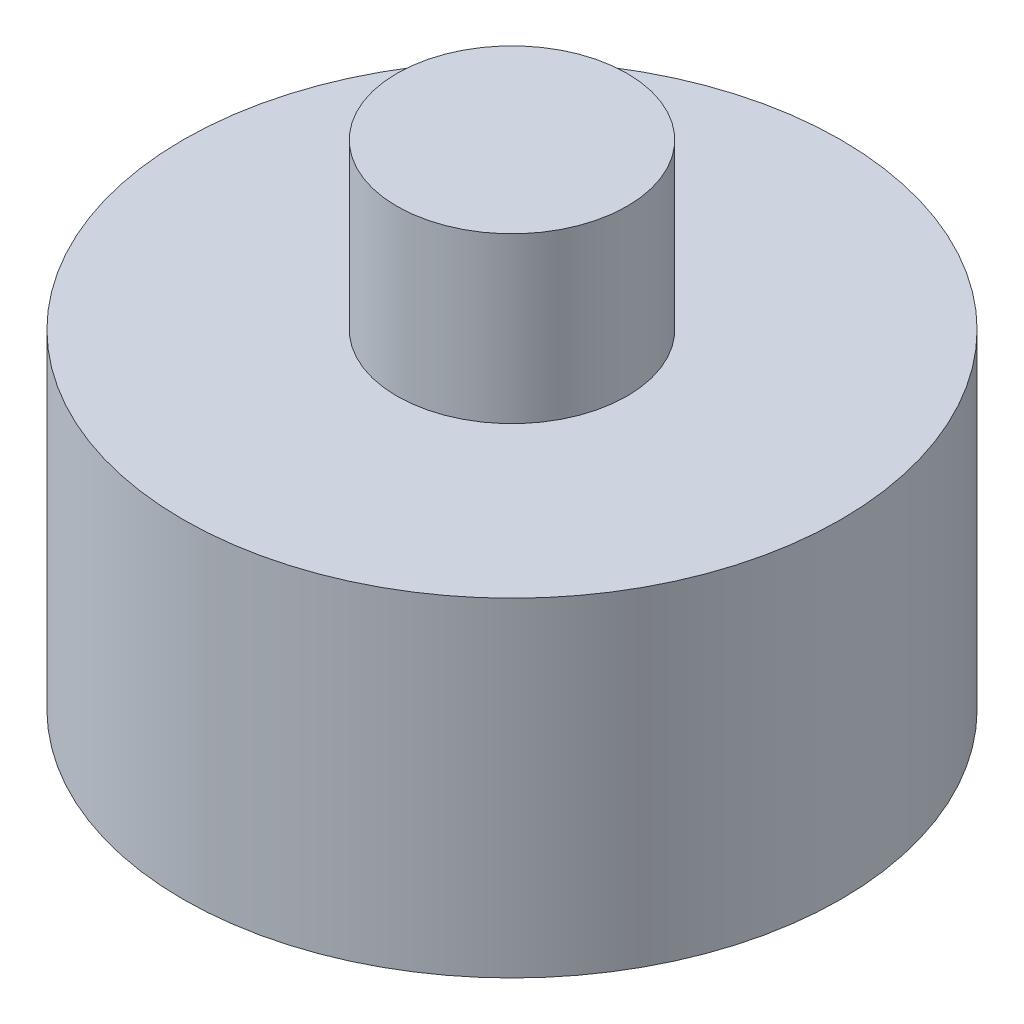
ISO-10303-21;
HEADER;
FILE_DESCRIPTION(('STEP AP214'),'2;1');
FILE_NAME('part.step','',(''),(''),'','','');
FILE_SCHEMA(('AUTOMOTIVE_DESIGN { 1 0 10303 214 1 1 1 1 }'));
ENDSEC;
DATA;
#1=APPLICATION_CONTEXT('core data for automotive mechanical design processes');
#2=APPLICATION_PROTOCOL_DEFINITION('international standard','automotive_design',2000,#1);
#3=PRODUCT_CONTEXT('',#1,'mechanical');
#4=PRODUCT('Part','Part','',(#3));
#5=PRODUCT_RELATED_PRODUCT_CATEGORY('part','',(#4));
#6=PRODUCT_DEFINITION_FORMATION('','',#4);
#7=PRODUCT_DEFINITION_CONTEXT('part definition',#1,'design');
#8=PRODUCT_DEFINITION('design','',#6,#7);
#9=PRODUCT_DEFINITION_SHAPE('','',#8);
#10=(LENGTH_UNIT() NAMED_UNIT(*) SI_UNIT(.MILLI.,.METRE.));
#11=(NAMED_UNIT(*) PLANE_ANGLE_UNIT() SI_UNIT($,.RADIAN.));
#12=(NAMED_UNIT(*) SI_UNIT($,.STERADIAN.) SOLID_ANGLE_UNIT());
#13=UNCERTAINTY_MEASURE_WITH_UNIT(LENGTH_MEASURE(1.E-05),#10,'distance_accuracy_value','');
#14=(GEOMETRIC_REPRESENTATION_CONTEXT(3) GLOBAL_UNCERTAINTY_ASSIGNED_CONTEXT((#13)) GLOBAL_UNIT_ASSIGNED_CONTEXT((#10,
#11,#12)) REPRESENTATION_CONTEXT('',''));
#15=CARTESIAN_POINT('',(0.,0.,0.));
#16=DIRECTION('',(0.,0.,1.));
#17=DIRECTION('',(1.,0.,0.));
#18=AXIS2_PLACEMENT_3D('',#15,#16,#17);
#19=CARTESIAN_POINT('',(0.,10.,0.));
#20=DIRECTION('',(0.,-1.,0.));
#21=DIRECTION('',(0.,0.,-1.));
#22=AXIS2_PLACEMENT_3D('',#19,#20,#21);
#23=CYLINDRICAL_SURFACE('',#22,10.);
#24=CARTESIAN_POINT('',(0.,10.,0.));
#25=DIRECTION('',(0.,1.,0.));
#26=DIRECTION('',(0.,0.,1.));
#27=AXIS2_PLACEMENT_3D('',#24,#25,#26);
#28=CIRCLE('',#27,10.);
#29=CARTESIAN_POINT('',(0.,10.,10.));
#30=VERTEX_POINT('',#29);
#31=EDGE_CURVE('E37',#30,#30,#28,.T.);
#32=ORIENTED_EDGE('',*,*,#31,.F.);
#33=EDGE_LOOP('',(#32));
#34=FACE_BOUND('',#33,.T.);
#35=CARTESIAN_POINT('',(0.,0.,0.));
#36=DIRECTION('',(0.,1.,0.));
#37=DIRECTION('',(0.,0.,1.));
#38=AXIS2_PLACEMENT_3D('',#35,#36,#37);
#39=CIRCLE('',#38,10.);
#40=CARTESIAN_POINT('',(0.,0.,10.));
#41=VERTEX_POINT('',#40);
#42=EDGE_CURVE('E33',#41,#41,#39,.T.);
#43=ORIENTED_EDGE('',*,*,#42,.T.);
#44=EDGE_LOOP('',(#43));
#45=FACE_BOUND('',#44,.T.);
#46=ADVANCED_FACE('F30',(#34,#45),#23,.T.);
#47=CARTESIAN_POINT('',(0.,10.,0.));
#48=DIRECTION('',(0.,1.,0.));
#49=DIRECTION('',(0.,0.,1.));
#50=AXIS2_PLACEMENT_3D('',#47,#48,#49);
#51=PLANE('',#50);
#52=CARTESIAN_POINT('',(0.,10.,0.));
#53=DIRECTION('',(0.,1.,0.));
#54=DIRECTION('',(0.,0.,1.));
#55=AXIS2_PLACEMENT_3D('',#52,#53,#54);
#56=CIRCLE('',#55,3.5);
#57=CARTESIAN_POINT('',(0.,10.,3.5));
#58=VERTEX_POINT('',#57);
#59=EDGE_CURVE('E10',#58,#58,#56,.T.);
#60=ORIENTED_EDGE('',*,*,#59,.F.);
#61=EDGE_LOOP('',(#60));
#62=FACE_BOUND('',#61,.T.);
#63=ORIENTED_EDGE('',*,*,#31,.T.);
#64=EDGE_LOOP('',(#63));
#65=FACE_BOUND('',#64,.T.);
#66=ADVANCED_FACE('F54',(#62,#65),#51,.T.);
#67=CARTESIAN_POINT('',(0.,0.,0.));
#68=DIRECTION('',(0.,1.,0.));
#69=DIRECTION('',(0.,0.,1.));
#70=AXIS2_PLACEMENT_3D('',#67,#68,#69);
#71=PLANE('',#70);
#72=ORIENTED_EDGE('',*,*,#42,.F.);
#73=EDGE_LOOP('',(#72));
#74=FACE_BOUND('',#73,.T.);
#75=ADVANCED_FACE('F51',(#74),#71,.F.);
#76=CARTESIAN_POINT('',(0.,15.,0.));
#77=DIRECTION('',(0.,-1.,0.));
#78=DIRECTION('',(0.,0.,-1.));
#79=AXIS2_PLACEMENT_3D('',#76,#77,#78);
#80=CYLINDRICAL_SURFACE('',#79,3.5);
#81=CARTESIAN_POINT('',(0.,15.,0.));
#82=DIRECTION('',(0.,1.,0.));
#83=DIRECTION('',(0.,0.,1.));
#84=AXIS2_PLACEMENT_3D('',#81,#82,#83);
#85=CIRCLE('',#84,3.5);
#86=CARTESIAN_POINT('',(0.,15.,3.5));
#87=VERTEX_POINT('',#86);
#88=EDGE_CURVE('E43',#87,#87,#85,.T.);
#89=ORIENTED_EDGE('',*,*,#88,.F.);
#90=EDGE_LOOP('',(#89));
#91=FACE_BOUND('',#90,.T.);
#92=ORIENTED_EDGE('',*,*,#59,.T.);
#93=EDGE_LOOP('',(#92));
#94=FACE_BOUND('',#93,.T.);
#95=ADVANCED_FACE('F53',(#91,#94),#80,.T.);
#96=CARTESIAN_POINT('',(0.,15.,0.));
#97=DIRECTION('',(0.,1.,0.));
#98=DIRECTION('',(0.,0.,1.));
#99=AXIS2_PLACEMENT_3D('',#96,#97,#98);
#100=PLANE('',#99);
#101=ORIENTED_EDGE('',*,*,#88,.T.);
#102=EDGE_LOOP('',(#101));
#103=FACE_BOUND('',#102,.T.);
#104=ADVANCED_FACE('F59',(#103),#100,.T.);
#105=CLOSED_SHELL('',(#46,#66,#75,#95,#104));
#106=MANIFOLD_SOLID_BREP('B2',#105);
#107=ADVANCED_BREP_SHAPE_REPRESENTATION('',(#18,#106),#14);
#108=SHAPE_DEFINITION_REPRESENTATION(#9,#107);
ENDSEC;
END-ISO-10303-21;
